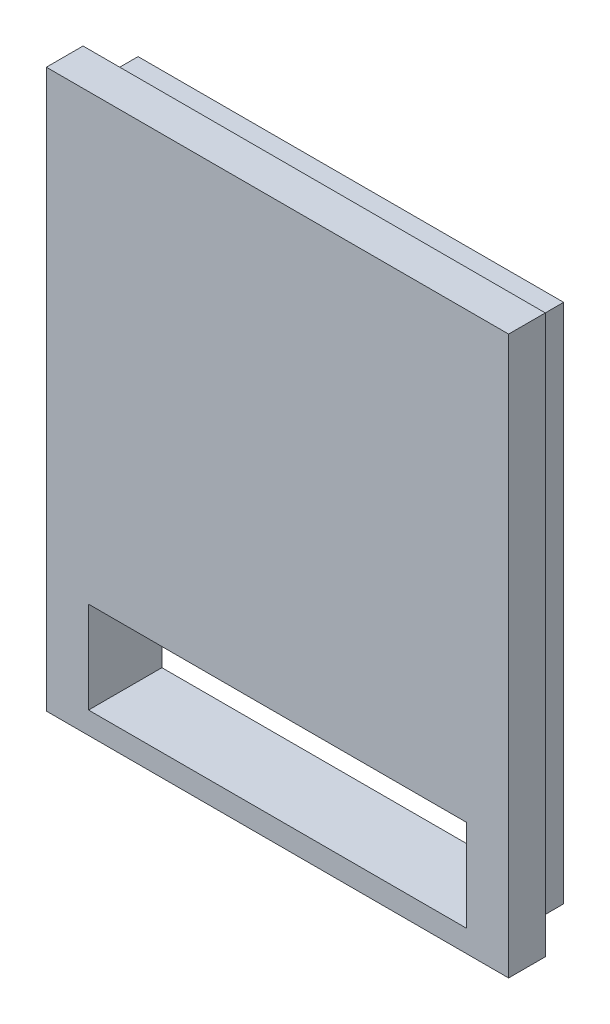
ISO-10303-21;
HEADER;
FILE_DESCRIPTION(('STEP AP214'),'2;1');
FILE_NAME('part.step','',(''),(''),'','','');
FILE_SCHEMA(('AUTOMOTIVE_DESIGN { 1 0 10303 214 1 1 1 1 }'));
ENDSEC;
DATA;
#1=APPLICATION_CONTEXT('core data for automotive mechanical design processes');
#2=APPLICATION_PROTOCOL_DEFINITION('international standard','automotive_design',2000,#1);
#3=PRODUCT_CONTEXT('',#1,'mechanical');
#4=PRODUCT('Part','Part','',(#3));
#5=PRODUCT_RELATED_PRODUCT_CATEGORY('part','',(#4));
#6=PRODUCT_DEFINITION_FORMATION('','',#4);
#7=PRODUCT_DEFINITION_CONTEXT('part definition',#1,'design');
#8=PRODUCT_DEFINITION('design','',#6,#7);
#9=PRODUCT_DEFINITION_SHAPE('','',#8);
#10=(LENGTH_UNIT() NAMED_UNIT(*) SI_UNIT(.MILLI.,.METRE.));
#11=(NAMED_UNIT(*) PLANE_ANGLE_UNIT() SI_UNIT($,.RADIAN.));
#12=(NAMED_UNIT(*) SI_UNIT($,.STERADIAN.) SOLID_ANGLE_UNIT());
#13=UNCERTAINTY_MEASURE_WITH_UNIT(LENGTH_MEASURE(1.E-05),#10,'distance_accuracy_value','');
#14=(GEOMETRIC_REPRESENTATION_CONTEXT(3) GLOBAL_UNCERTAINTY_ASSIGNED_CONTEXT((#13)) GLOBAL_UNIT_ASSIGNED_CONTEXT((#10,
#11,#12)) REPRESENTATION_CONTEXT('',''));
#15=CARTESIAN_POINT('',(0.,0.,0.));
#16=DIRECTION('',(0.,0.,1.));
#17=DIRECTION('',(1.,0.,0.));
#18=AXIS2_PLACEMENT_3D('',#15,#16,#17);
#19=CARTESIAN_POINT('',(6.3,-7.6,1.));
#20=DIRECTION('',(-1.,0.,0.));
#21=DIRECTION('',(0.,0.,1.));
#22=AXIS2_PLACEMENT_3D('',#19,#20,#21);
#23=PLANE('',#22);
#24=DIRECTION('',(0.,1.,0.));
#25=VECTOR('',#24,1.);
#26=CARTESIAN_POINT('',(6.3,-7.6,0.));
#27=LINE('',#26,#25);
#28=CARTESIAN_POINT('',(6.3,-7.6,0.));
#29=VERTEX_POINT('',#28);
#30=CARTESIAN_POINT('',(6.3,7.6,0.));
#31=VERTEX_POINT('',#30);
#32=EDGE_CURVE('E221',#29,#31,#27,.T.);
#33=ORIENTED_EDGE('',*,*,#32,.T.);
#34=DIRECTION('',(0.,0.,-1.));
#35=VECTOR('',#34,1.);
#36=CARTESIAN_POINT('',(6.3,7.6,1.));
#37=LINE('',#36,#35);
#38=CARTESIAN_POINT('',(6.3,7.6,1.));
#39=VERTEX_POINT('',#38);
#40=EDGE_CURVE('E11',#39,#31,#37,.T.);
#41=ORIENTED_EDGE('',*,*,#40,.F.);
#42=DIRECTION('',(0.,1.,0.));
#43=VECTOR('',#42,1.);
#44=CARTESIAN_POINT('',(6.3,-7.6,1.));
#45=LINE('',#44,#43);
#46=CARTESIAN_POINT('',(6.3,-7.6,1.));
#47=VERTEX_POINT('',#46);
#48=EDGE_CURVE('E222',#47,#39,#45,.T.);
#49=ORIENTED_EDGE('',*,*,#48,.F.);
#50=DIRECTION('',(0.,0.,-1.));
#51=VECTOR('',#50,1.);
#52=CARTESIAN_POINT('',(6.3,-7.6,1.));
#53=LINE('',#52,#51);
#54=EDGE_CURVE('E236',#47,#29,#53,.T.);
#55=ORIENTED_EDGE('',*,*,#54,.T.);
#56=EDGE_LOOP('',(#33,#41,#49,#55));
#57=FACE_BOUND('',#56,.T.);
#58=ADVANCED_FACE('F39',(#57),#23,.F.);
#59=CARTESIAN_POINT('',(-6.3,7.6,1.));
#60=DIRECTION('',(0.,-1.,0.));
#61=DIRECTION('',(0.,0.,-1.));
#62=AXIS2_PLACEMENT_3D('',#59,#60,#61);
#63=PLANE('',#62);
#64=DIRECTION('',(-1.,0.,0.));
#65=VECTOR('',#64,1.);
#66=CARTESIAN_POINT('',(-6.3,7.6,0.));
#67=LINE('',#66,#65);
#68=CARTESIAN_POINT('',(-6.3,7.6,0.));
#69=VERTEX_POINT('',#68);
#70=EDGE_CURVE('E240',#31,#69,#67,.T.);
#71=ORIENTED_EDGE('',*,*,#70,.T.);
#72=DIRECTION('',(0.,0.,-1.));
#73=VECTOR('',#72,1.);
#74=CARTESIAN_POINT('',(-6.3,7.6,1.));
#75=LINE('',#74,#73);
#76=CARTESIAN_POINT('',(-6.3,7.6,1.));
#77=VERTEX_POINT('',#76);
#78=EDGE_CURVE('E47',#77,#69,#75,.T.);
#79=ORIENTED_EDGE('',*,*,#78,.F.);
#80=DIRECTION('',(-1.,0.,0.));
#81=VECTOR('',#80,1.);
#82=CARTESIAN_POINT('',(-6.3,7.6,1.));
#83=LINE('',#82,#81);
#84=EDGE_CURVE('E226',#39,#77,#83,.T.);
#85=ORIENTED_EDGE('',*,*,#84,.F.);
#86=ORIENTED_EDGE('',*,*,#40,.T.);
#87=EDGE_LOOP('',(#71,#79,#85,#86));
#88=FACE_BOUND('',#87,.T.);
#89=ADVANCED_FACE('F276',(#88),#63,.F.);
#90=CARTESIAN_POINT('',(-6.3,-7.6,1.));
#91=DIRECTION('',(1.,0.,0.));
#92=DIRECTION('',(0.,0.,-1.));
#93=AXIS2_PLACEMENT_3D('',#90,#91,#92);
#94=PLANE('',#93);
#95=DIRECTION('',(0.,-1.,0.));
#96=VECTOR('',#95,1.);
#97=CARTESIAN_POINT('',(-6.3,-7.6,0.));
#98=LINE('',#97,#96);
#99=CARTESIAN_POINT('',(-6.3,-7.6,0.));
#100=VERTEX_POINT('',#99);
#101=EDGE_CURVE('E243',#69,#100,#98,.T.);
#102=ORIENTED_EDGE('',*,*,#101,.T.);
#103=DIRECTION('',(0.,0.,-1.));
#104=VECTOR('',#103,1.);
#105=CARTESIAN_POINT('',(-6.3,-7.6,1.));
#106=LINE('',#105,#104);
#107=CARTESIAN_POINT('',(-6.3,-7.6,1.));
#108=VERTEX_POINT('',#107);
#109=EDGE_CURVE('E251',#108,#100,#106,.T.);
#110=ORIENTED_EDGE('',*,*,#109,.F.);
#111=DIRECTION('',(0.,-1.,0.));
#112=VECTOR('',#111,1.);
#113=CARTESIAN_POINT('',(-6.3,-7.6,1.));
#114=LINE('',#113,#112);
#115=EDGE_CURVE('E230',#77,#108,#114,.T.);
#116=ORIENTED_EDGE('',*,*,#115,.F.);
#117=ORIENTED_EDGE('',*,*,#78,.T.);
#118=EDGE_LOOP('',(#102,#110,#116,#117));
#119=FACE_BOUND('',#118,.T.);
#120=ADVANCED_FACE('F260',(#119),#94,.F.);
#121=CARTESIAN_POINT('',(-6.3,-7.6,1.));
#122=DIRECTION('',(0.,1.,0.));
#123=DIRECTION('',(0.,0.,1.));
#124=AXIS2_PLACEMENT_3D('',#121,#122,#123);
#125=PLANE('',#124);
#126=DIRECTION('',(1.,0.,0.));
#127=VECTOR('',#126,1.);
#128=CARTESIAN_POINT('',(-6.3,-7.6,0.));
#129=LINE('',#128,#127);
#130=EDGE_CURVE('E227',#100,#29,#129,.T.);
#131=ORIENTED_EDGE('',*,*,#130,.T.);
#132=ORIENTED_EDGE('',*,*,#54,.F.);
#133=DIRECTION('',(1.,0.,0.));
#134=VECTOR('',#133,1.);
#135=CARTESIAN_POINT('',(-6.3,-7.6,1.));
#136=LINE('',#135,#134);
#137=EDGE_CURVE('E233',#108,#47,#136,.T.);
#138=ORIENTED_EDGE('',*,*,#137,.F.);
#139=ORIENTED_EDGE('',*,*,#109,.T.);
#140=EDGE_LOOP('',(#131,#132,#138,#139));
#141=FACE_BOUND('',#140,.T.);
#142=ADVANCED_FACE('F269',(#141),#125,.F.);
#143=CARTESIAN_POINT('',(0.,0.,1.));
#144=DIRECTION('',(0.,0.,-1.));
#145=DIRECTION('',(-1.,0.,0.));
#146=AXIS2_PLACEMENT_3D('',#143,#144,#145);
#147=PLANE('',#146);
#148=DIRECTION('',(-1.,0.,0.));
#149=VECTOR('',#148,1.);
#150=CARTESIAN_POINT('',(0.,-7.,1.));
#151=LINE('',#150,#149);
#152=CARTESIAN_POINT('',(5.15,-7.,1.));
#153=VERTEX_POINT('',#152);
#154=CARTESIAN_POINT('',(-5.15,-7.,1.));
#155=VERTEX_POINT('',#154);
#156=EDGE_CURVE('E168',#153,#155,#151,.T.);
#157=ORIENTED_EDGE('',*,*,#156,.T.);
#158=DIRECTION('',(0.,1.,0.));
#159=VECTOR('',#158,1.);
#160=CARTESIAN_POINT('',(-5.15,0.,1.));
#161=LINE('',#160,#159);
#162=CARTESIAN_POINT('',(-5.15,-4.5,1.));
#163=VERTEX_POINT('',#162);
#164=EDGE_CURVE('E172',#155,#163,#161,.T.);
#165=ORIENTED_EDGE('',*,*,#164,.T.);
#166=DIRECTION('',(1.,0.,0.));
#167=VECTOR('',#166,1.);
#168=CARTESIAN_POINT('',(0.,-4.5,1.));
#169=LINE('',#168,#167);
#170=CARTESIAN_POINT('',(5.15,-4.5,1.));
#171=VERTEX_POINT('',#170);
#172=EDGE_CURVE('E159',#163,#171,#169,.T.);
#173=ORIENTED_EDGE('',*,*,#172,.T.);
#174=DIRECTION('',(0.,-1.,0.));
#175=VECTOR('',#174,1.);
#176=CARTESIAN_POINT('',(5.15,0.,1.));
#177=LINE('',#176,#175);
#178=EDGE_CURVE('E134',#171,#153,#177,.T.);
#179=ORIENTED_EDGE('',*,*,#178,.T.);
#180=EDGE_LOOP('',(#157,#165,#173,#179));
#181=FACE_BOUND('',#180,.T.);
#182=ORIENTED_EDGE('',*,*,#48,.T.);
#183=ORIENTED_EDGE('',*,*,#84,.T.);
#184=ORIENTED_EDGE('',*,*,#115,.T.);
#185=ORIENTED_EDGE('',*,*,#137,.T.);
#186=EDGE_LOOP('',(#182,#183,#184,#185));
#187=FACE_BOUND('',#186,.T.);
#188=ADVANCED_FACE('F275',(#181,#187),#147,.F.);
#189=CARTESIAN_POINT('',(0.,0.,0.));
#190=DIRECTION('',(0.,0.,-1.));
#191=DIRECTION('',(-1.,0.,0.));
#192=AXIS2_PLACEMENT_3D('',#189,#190,#191);
#193=PLANE('',#192);
#194=DIRECTION('',(0.,1.,0.));
#195=VECTOR('',#194,1.);
#196=CARTESIAN_POINT('',(-5.8,-7.1,0.));
#197=LINE('',#196,#195);
#198=CARTESIAN_POINT('',(-5.8,-7.1,0.));
#199=VERTEX_POINT('',#198);
#200=CARTESIAN_POINT('',(-5.8,7.1,0.));
#201=VERTEX_POINT('',#200);
#202=EDGE_CURVE('E176',#199,#201,#197,.T.);
#203=ORIENTED_EDGE('',*,*,#202,.F.);
#204=DIRECTION('',(-1.,0.,0.));
#205=VECTOR('',#204,1.);
#206=CARTESIAN_POINT('',(5.8,-7.1,0.));
#207=LINE('',#206,#205);
#208=CARTESIAN_POINT('',(5.8,-7.1,0.));
#209=VERTEX_POINT('',#208);
#210=EDGE_CURVE('E182',#209,#199,#207,.T.);
#211=ORIENTED_EDGE('',*,*,#210,.F.);
#212=DIRECTION('',(0.,-1.,0.));
#213=VECTOR('',#212,1.);
#214=CARTESIAN_POINT('',(5.8,-7.1,0.));
#215=LINE('',#214,#213);
#216=CARTESIAN_POINT('',(5.8,7.1,0.));
#217=VERTEX_POINT('',#216);
#218=EDGE_CURVE('E199',#217,#209,#215,.T.);
#219=ORIENTED_EDGE('',*,*,#218,.F.);
#220=DIRECTION('',(1.,0.,0.));
#221=VECTOR('',#220,1.);
#222=CARTESIAN_POINT('',(5.8,7.1,0.));
#223=LINE('',#222,#221);
#224=EDGE_CURVE('E195',#201,#217,#223,.T.);
#225=ORIENTED_EDGE('',*,*,#224,.F.);
#226=EDGE_LOOP('',(#203,#211,#219,#225));
#227=FACE_BOUND('',#226,.T.);
#228=ORIENTED_EDGE('',*,*,#32,.F.);
#229=ORIENTED_EDGE('',*,*,#130,.F.);
#230=ORIENTED_EDGE('',*,*,#101,.F.);
#231=ORIENTED_EDGE('',*,*,#70,.F.);
#232=EDGE_LOOP('',(#228,#229,#230,#231));
#233=FACE_BOUND('',#232,.T.);
#234=ADVANCED_FACE('F266',(#227,#233),#193,.T.);
#235=CARTESIAN_POINT('',(-5.8,-7.1,-1.));
#236=DIRECTION('',(1.,0.,0.));
#237=DIRECTION('',(0.,0.,-1.));
#238=AXIS2_PLACEMENT_3D('',#235,#236,#237);
#239=PLANE('',#238);
#240=ORIENTED_EDGE('',*,*,#202,.T.);
#241=DIRECTION('',(0.,0.,1.));
#242=VECTOR('',#241,1.);
#243=CARTESIAN_POINT('',(-5.8,7.1,-1.));
#244=LINE('',#243,#242);
#245=CARTESIAN_POINT('',(-5.8,7.1,-1.));
#246=VERTEX_POINT('',#245);
#247=EDGE_CURVE('E217',#246,#201,#244,.T.);
#248=ORIENTED_EDGE('',*,*,#247,.F.);
#249=DIRECTION('',(0.,1.,0.));
#250=VECTOR('',#249,1.);
#251=CARTESIAN_POINT('',(-5.8,-7.1,-1.));
#252=LINE('',#251,#250);
#253=CARTESIAN_POINT('',(-5.8,-7.1,-1.));
#254=VERTEX_POINT('',#253);
#255=EDGE_CURVE('E177',#254,#246,#252,.T.);
#256=ORIENTED_EDGE('',*,*,#255,.F.);
#257=DIRECTION('',(0.,0.,1.));
#258=VECTOR('',#257,1.);
#259=CARTESIAN_POINT('',(-5.8,-7.1,-1.));
#260=LINE('',#259,#258);
#261=EDGE_CURVE('E191',#254,#199,#260,.T.);
#262=ORIENTED_EDGE('',*,*,#261,.T.);
#263=EDGE_LOOP('',(#240,#248,#256,#262));
#264=FACE_BOUND('',#263,.T.);
#265=ADVANCED_FACE('F288',(#264),#239,.F.);
#266=CARTESIAN_POINT('',(5.8,7.1,-1.));
#267=DIRECTION('',(0.,-1.,0.));
#268=DIRECTION('',(0.,0.,-1.));
#269=AXIS2_PLACEMENT_3D('',#266,#267,#268);
#270=PLANE('',#269);
#271=ORIENTED_EDGE('',*,*,#224,.T.);
#272=DIRECTION('',(0.,0.,1.));
#273=VECTOR('',#272,1.);
#274=CARTESIAN_POINT('',(5.8,7.1,-1.));
#275=LINE('',#274,#273);
#276=CARTESIAN_POINT('',(5.8,7.1,-1.));
#277=VERTEX_POINT('',#276);
#278=EDGE_CURVE('E213',#277,#217,#275,.T.);
#279=ORIENTED_EDGE('',*,*,#278,.F.);
#280=DIRECTION('',(1.,0.,0.));
#281=VECTOR('',#280,1.);
#282=CARTESIAN_POINT('',(5.8,7.1,-1.));
#283=LINE('',#282,#281);
#284=EDGE_CURVE('E181',#246,#277,#283,.T.);
#285=ORIENTED_EDGE('',*,*,#284,.F.);
#286=ORIENTED_EDGE('',*,*,#247,.T.);
#287=EDGE_LOOP('',(#271,#279,#285,#286));
#288=FACE_BOUND('',#287,.T.);
#289=ADVANCED_FACE('F295',(#288),#270,.F.);
#290=CARTESIAN_POINT('',(5.8,-7.1,-1.));
#291=DIRECTION('',(-1.,0.,0.));
#292=DIRECTION('',(0.,0.,1.));
#293=AXIS2_PLACEMENT_3D('',#290,#291,#292);
#294=PLANE('',#293);
#295=ORIENTED_EDGE('',*,*,#218,.T.);
#296=DIRECTION('',(0.,0.,1.));
#297=VECTOR('',#296,1.);
#298=CARTESIAN_POINT('',(5.8,-7.1,-1.));
#299=LINE('',#298,#297);
#300=CARTESIAN_POINT('',(5.8,-7.1,-1.));
#301=VERTEX_POINT('',#300);
#302=EDGE_CURVE('E209',#301,#209,#299,.T.);
#303=ORIENTED_EDGE('',*,*,#302,.F.);
#304=DIRECTION('',(0.,-1.,0.));
#305=VECTOR('',#304,1.);
#306=CARTESIAN_POINT('',(5.8,-7.1,-1.));
#307=LINE('',#306,#305);
#308=EDGE_CURVE('E185',#277,#301,#307,.T.);
#309=ORIENTED_EDGE('',*,*,#308,.F.);
#310=ORIENTED_EDGE('',*,*,#278,.T.);
#311=EDGE_LOOP('',(#295,#303,#309,#310));
#312=FACE_BOUND('',#311,.T.);
#313=ADVANCED_FACE('F299',(#312),#294,.F.);
#314=CARTESIAN_POINT('',(5.8,-7.1,-1.));
#315=DIRECTION('',(0.,1.,0.));
#316=DIRECTION('',(0.,0.,1.));
#317=AXIS2_PLACEMENT_3D('',#314,#315,#316);
#318=PLANE('',#317);
#319=ORIENTED_EDGE('',*,*,#210,.T.);
#320=ORIENTED_EDGE('',*,*,#261,.F.);
#321=DIRECTION('',(-1.,0.,0.));
#322=VECTOR('',#321,1.);
#323=CARTESIAN_POINT('',(5.8,-7.1,-1.));
#324=LINE('',#323,#322);
#325=EDGE_CURVE('E188',#301,#254,#324,.T.);
#326=ORIENTED_EDGE('',*,*,#325,.F.);
#327=ORIENTED_EDGE('',*,*,#302,.T.);
#328=EDGE_LOOP('',(#319,#320,#326,#327));
#329=FACE_BOUND('',#328,.T.);
#330=ADVANCED_FACE('F303',(#329),#318,.F.);
#331=CARTESIAN_POINT('',(0.,0.,-1.));
#332=DIRECTION('',(0.,0.,1.));
#333=DIRECTION('',(1.,0.,0.));
#334=AXIS2_PLACEMENT_3D('',#331,#332,#333);
#335=PLANE('',#334);
#336=DIRECTION('',(1.,0.,0.));
#337=VECTOR('',#336,1.);
#338=CARTESIAN_POINT('',(5.15,-4.5,-1.));
#339=LINE('',#338,#337);
#340=CARTESIAN_POINT('',(-5.15,-4.5,-1.));
#341=VERTEX_POINT('',#340);
#342=CARTESIAN_POINT('',(5.15,-4.5,-1.));
#343=VERTEX_POINT('',#342);
#344=EDGE_CURVE('E141',#341,#343,#339,.T.);
#345=ORIENTED_EDGE('',*,*,#344,.F.);
#346=DIRECTION('',(0.,1.,0.));
#347=VECTOR('',#346,1.);
#348=CARTESIAN_POINT('',(-5.15,-4.5,-1.));
#349=LINE('',#348,#347);
#350=CARTESIAN_POINT('',(-5.15,-7.,-1.));
#351=VERTEX_POINT('',#350);
#352=EDGE_CURVE('E62',#351,#341,#349,.T.);
#353=ORIENTED_EDGE('',*,*,#352,.F.);
#354=DIRECTION('',(-1.,0.,0.));
#355=VECTOR('',#354,1.);
#356=CARTESIAN_POINT('',(5.15,-7.,-1.));
#357=LINE('',#356,#355);
#358=CARTESIAN_POINT('',(5.15,-7.,-1.));
#359=VERTEX_POINT('',#358);
#360=EDGE_CURVE('E149',#359,#351,#357,.T.);
#361=ORIENTED_EDGE('',*,*,#360,.F.);
#362=DIRECTION('',(0.,-1.,0.));
#363=VECTOR('',#362,1.);
#364=CARTESIAN_POINT('',(5.15,-4.5,-1.));
#365=LINE('',#364,#363);
#366=EDGE_CURVE('E131',#343,#359,#365,.T.);
#367=ORIENTED_EDGE('',*,*,#366,.F.);
#368=EDGE_LOOP('',(#345,#353,#361,#367));
#369=FACE_BOUND('',#368,.T.);
#370=ORIENTED_EDGE('',*,*,#255,.T.);
#371=ORIENTED_EDGE('',*,*,#284,.T.);
#372=ORIENTED_EDGE('',*,*,#308,.T.);
#373=ORIENTED_EDGE('',*,*,#325,.T.);
#374=EDGE_LOOP('',(#370,#371,#372,#373));
#375=FACE_BOUND('',#374,.T.);
#376=ADVANCED_FACE('F146',(#369,#375),#335,.F.);
#377=CARTESIAN_POINT('',(-5.15,-4.5,3.));
#378=DIRECTION('',(-1.,0.,0.));
#379=DIRECTION('',(0.,0.,1.));
#380=AXIS2_PLACEMENT_3D('',#377,#378,#379);
#381=PLANE('',#380);
#382=DIRECTION('',(0.,0.,-1.));
#383=VECTOR('',#382,1.);
#384=CARTESIAN_POINT('',(-5.15,-7.,3.));
#385=LINE('',#384,#383);
#386=EDGE_CURVE('E156',#155,#351,#385,.T.);
#387=ORIENTED_EDGE('',*,*,#386,.T.);
#388=ORIENTED_EDGE('',*,*,#352,.T.);
#389=DIRECTION('',(0.,0.,-1.));
#390=VECTOR('',#389,1.);
#391=CARTESIAN_POINT('',(-5.15,-4.5,3.));
#392=LINE('',#391,#390);
#393=EDGE_CURVE('E138',#163,#341,#392,.T.);
#394=ORIENTED_EDGE('',*,*,#393,.F.);
#395=ORIENTED_EDGE('',*,*,#164,.F.);
#396=EDGE_LOOP('',(#387,#388,#394,#395));
#397=FACE_BOUND('',#396,.T.);
#398=ADVANCED_FACE('F310',(#397),#381,.F.);
#399=CARTESIAN_POINT('',(5.15,-7.,3.));
#400=DIRECTION('',(0.,-1.,0.));
#401=DIRECTION('',(0.,0.,-1.));
#402=AXIS2_PLACEMENT_3D('',#399,#400,#401);
#403=PLANE('',#402);
#404=DIRECTION('',(0.,0.,-1.));
#405=VECTOR('',#404,1.);
#406=CARTESIAN_POINT('',(5.15,-7.,3.));
#407=LINE('',#406,#405);
#408=EDGE_CURVE('E137',#153,#359,#407,.T.);
#409=ORIENTED_EDGE('',*,*,#408,.T.);
#410=ORIENTED_EDGE('',*,*,#360,.T.);
#411=ORIENTED_EDGE('',*,*,#386,.F.);
#412=ORIENTED_EDGE('',*,*,#156,.F.);
#413=EDGE_LOOP('',(#409,#410,#411,#412));
#414=FACE_BOUND('',#413,.T.);
#415=ADVANCED_FACE('F313',(#414),#403,.F.);
#416=CARTESIAN_POINT('',(5.15,-4.5,3.));
#417=DIRECTION('',(1.,0.,0.));
#418=DIRECTION('',(0.,0.,-1.));
#419=AXIS2_PLACEMENT_3D('',#416,#417,#418);
#420=PLANE('',#419);
#421=DIRECTION('',(0.,0.,-1.));
#422=VECTOR('',#421,1.);
#423=CARTESIAN_POINT('',(5.15,-4.5,3.));
#424=LINE('',#423,#422);
#425=EDGE_CURVE('E54',#171,#343,#424,.T.);
#426=ORIENTED_EDGE('',*,*,#425,.T.);
#427=ORIENTED_EDGE('',*,*,#366,.T.);
#428=ORIENTED_EDGE('',*,*,#408,.F.);
#429=ORIENTED_EDGE('',*,*,#178,.F.);
#430=EDGE_LOOP('',(#426,#427,#428,#429));
#431=FACE_BOUND('',#430,.T.);
#432=ADVANCED_FACE('F128',(#431),#420,.F.);
#433=CARTESIAN_POINT('',(5.15,-4.5,3.));
#434=DIRECTION('',(0.,1.,0.));
#435=DIRECTION('',(-1.,0.,0.));
#436=AXIS2_PLACEMENT_3D('',#433,#434,#435);
#437=PLANE('',#436);
#438=ORIENTED_EDGE('',*,*,#393,.T.);
#439=ORIENTED_EDGE('',*,*,#344,.T.);
#440=ORIENTED_EDGE('',*,*,#425,.F.);
#441=ORIENTED_EDGE('',*,*,#172,.F.);
#442=EDGE_LOOP('',(#438,#439,#440,#441));
#443=FACE_BOUND('',#442,.T.);
#444=ADVANCED_FACE('F142',(#443),#437,.F.);
#445=CLOSED_SHELL('',(#58,#89,#120,#142,#188,#234,#265,#289,#313,#330,#376,#398,#415,#432,#444));
#446=MANIFOLD_SOLID_BREP('B2',#445);
#447=ADVANCED_BREP_SHAPE_REPRESENTATION('',(#18,#446),#14);
#448=SHAPE_DEFINITION_REPRESENTATION(#9,#447);
ENDSEC;
END-ISO-10303-21;
